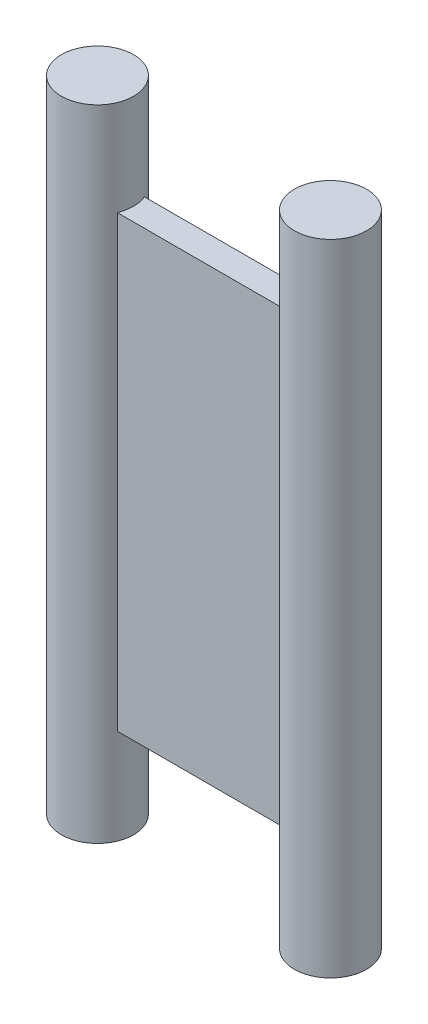
ISO-10303-21;
HEADER;
FILE_DESCRIPTION(('STEP AP214'),'2;1');
FILE_NAME('part.step','',(''),(''),'','','');
FILE_SCHEMA(('AUTOMOTIVE_DESIGN { 1 0 10303 214 1 1 1 1 }'));
ENDSEC;
DATA;
#1=APPLICATION_CONTEXT('core data for automotive mechanical design processes');
#2=APPLICATION_PROTOCOL_DEFINITION('international standard','automotive_design',2000,#1);
#3=PRODUCT_CONTEXT('',#1,'mechanical');
#4=PRODUCT('Part','Part','',(#3));
#5=PRODUCT_RELATED_PRODUCT_CATEGORY('part','',(#4));
#6=PRODUCT_DEFINITION_FORMATION('','',#4);
#7=PRODUCT_DEFINITION_CONTEXT('part definition',#1,'design');
#8=PRODUCT_DEFINITION('design','',#6,#7);
#9=PRODUCT_DEFINITION_SHAPE('','',#8);
#10=(LENGTH_UNIT() NAMED_UNIT(*) SI_UNIT(.MILLI.,.METRE.));
#11=(NAMED_UNIT(*) PLANE_ANGLE_UNIT() SI_UNIT($,.RADIAN.));
#12=(NAMED_UNIT(*) SI_UNIT($,.STERADIAN.) SOLID_ANGLE_UNIT());
#13=UNCERTAINTY_MEASURE_WITH_UNIT(LENGTH_MEASURE(1.E-05),#10,'distance_accuracy_value','');
#14=(GEOMETRIC_REPRESENTATION_CONTEXT(3) GLOBAL_UNCERTAINTY_ASSIGNED_CONTEXT((#13)) GLOBAL_UNIT_ASSIGNED_CONTEXT((#10,
#11,#12)) REPRESENTATION_CONTEXT('',''));
#15=CARTESIAN_POINT('',(0.,0.,0.));
#16=DIRECTION('',(0.,0.,1.));
#17=DIRECTION('',(1.,0.,0.));
#18=AXIS2_PLACEMENT_3D('',#15,#16,#17);
#19=CARTESIAN_POINT('',(4.28,16.5,0.5));
#20=DIRECTION('',(0.,0.,-1.));
#21=DIRECTION('',(-1.,0.,0.));
#22=AXIS2_PLACEMENT_3D('',#19,#20,#21);
#23=PLANE('',#22);
#24=DIRECTION('',(0.,-1.,0.));
#25=VECTOR('',#24,1.);
#26=CARTESIAN_POINT('',(3.0529608808192,20.,0.5));
#27=LINE('',#26,#25);
#28=CARTESIAN_POINT('',(3.0529608808192,16.5,0.5));
#29=VERTEX_POINT('',#28);
#30=CARTESIAN_POINT('',(3.0529608808192,0.,0.5));
#31=VERTEX_POINT('',#30);
#32=EDGE_CURVE('E53',#29,#31,#27,.T.);
#33=ORIENTED_EDGE('',*,*,#32,.F.);
#34=DIRECTION('',(1.,0.,0.));
#35=VECTOR('',#34,1.);
#36=CARTESIAN_POINT('',(4.28,16.5,0.5));
#37=LINE('',#36,#35);
#38=CARTESIAN_POINT('',(-3.0529608808192,16.5,0.500000000000001));
#39=VERTEX_POINT('',#38);
#40=EDGE_CURVE('E90',#39,#29,#37,.T.);
#41=ORIENTED_EDGE('',*,*,#40,.F.);
#42=DIRECTION('',(0.,-1.,0.));
#43=VECTOR('',#42,1.);
#44=CARTESIAN_POINT('',(-3.0529608808192,20.,0.500000000000001));
#45=LINE('',#44,#43);
#46=CARTESIAN_POINT('',(-3.0529608808192,0.,0.500000000000001));
#47=VERTEX_POINT('',#46);
#48=EDGE_CURVE('E103',#47,#39,#45,.F.);
#49=ORIENTED_EDGE('',*,*,#48,.F.);
#50=DIRECTION('',(1.,0.,0.));
#51=VECTOR('',#50,1.);
#52=CARTESIAN_POINT('',(4.28,0.,0.5));
#53=LINE('',#52,#51);
#54=EDGE_CURVE('E91',#47,#31,#53,.T.);
#55=ORIENTED_EDGE('',*,*,#54,.T.);
#56=EDGE_LOOP('',(#33,#41,#49,#55));
#57=FACE_BOUND('',#56,.T.);
#58=ADVANCED_FACE('F39',(#57),#23,.F.);
#59=CARTESIAN_POINT('',(4.28,16.5,-0.5));
#60=DIRECTION('',(0.,0.,1.));
#61=DIRECTION('',(1.,0.,0.));
#62=AXIS2_PLACEMENT_3D('',#59,#60,#61);
#63=PLANE('',#62);
#64=DIRECTION('',(0.,-1.,0.));
#65=VECTOR('',#64,1.);
#66=CARTESIAN_POINT('',(3.0529608808192,20.,-0.5));
#67=LINE('',#66,#65);
#68=CARTESIAN_POINT('',(3.0529608808192,0.,-0.5));
#69=VERTEX_POINT('',#68);
#70=CARTESIAN_POINT('',(3.0529608808192,16.5,-0.5));
#71=VERTEX_POINT('',#70);
#72=EDGE_CURVE('E78',#69,#71,#67,.F.);
#73=ORIENTED_EDGE('',*,*,#72,.F.);
#74=DIRECTION('',(-1.,0.,0.));
#75=VECTOR('',#74,1.);
#76=CARTESIAN_POINT('',(4.28,0.,-0.5));
#77=LINE('',#76,#75);
#78=CARTESIAN_POINT('',(-3.0529608808192,0.,-0.499999999999999));
#79=VERTEX_POINT('',#78);
#80=EDGE_CURVE('E60',#69,#79,#77,.T.);
#81=ORIENTED_EDGE('',*,*,#80,.T.);
#82=DIRECTION('',(0.,-1.,0.));
#83=VECTOR('',#82,1.);
#84=CARTESIAN_POINT('',(-3.0529608808192,20.,-0.499999999999999));
#85=LINE('',#84,#83);
#86=CARTESIAN_POINT('',(-3.0529608808192,16.5,-0.499999999999999));
#87=VERTEX_POINT('',#86);
#88=EDGE_CURVE('E105',#87,#79,#85,.T.);
#89=ORIENTED_EDGE('',*,*,#88,.F.);
#90=DIRECTION('',(-1.,0.,0.));
#91=VECTOR('',#90,1.);
#92=CARTESIAN_POINT('',(4.28,16.5,-0.5));
#93=LINE('',#92,#91);
#94=EDGE_CURVE('E85',#71,#87,#93,.T.);
#95=ORIENTED_EDGE('',*,*,#94,.F.);
#96=EDGE_LOOP('',(#73,#81,#89,#95));
#97=FACE_BOUND('',#96,.T.);
#98=ADVANCED_FACE('F84',(#97),#63,.F.);
#99=CARTESIAN_POINT('',(-4.28,20.,0.));
#100=DIRECTION('',(0.,-1.,0.));
#101=DIRECTION('',(0.,0.,-1.));
#102=AXIS2_PLACEMENT_3D('',#99,#100,#101);
#103=CYLINDRICAL_SURFACE('',#102,1.325);
#104=CARTESIAN_POINT('',(-4.28,20.,0.));
#105=DIRECTION('',(0.,1.,0.));
#106=DIRECTION('',(0.,0.,1.));
#107=AXIS2_PLACEMENT_3D('',#104,#105,#106);
#108=CIRCLE('',#107,1.325);
#109=CARTESIAN_POINT('',(-4.28,20.,1.325));
#110=VERTEX_POINT('',#109);
#111=EDGE_CURVE('E107',#110,#110,#108,.T.);
#112=ORIENTED_EDGE('',*,*,#111,.F.);
#113=EDGE_LOOP('',(#112));
#114=FACE_BOUND('',#113,.T.);
#115=CARTESIAN_POINT('',(-4.28,-3.5,0.));
#116=DIRECTION('',(0.,1.,0.));
#117=DIRECTION('',(0.,0.,1.));
#118=AXIS2_PLACEMENT_3D('',#115,#116,#117);
#119=CIRCLE('',#118,1.325);
#120=CARTESIAN_POINT('',(-4.28,-3.5,1.325));
#121=VERTEX_POINT('',#120);
#122=EDGE_CURVE('E108',#121,#121,#119,.T.);
#123=ORIENTED_EDGE('',*,*,#122,.T.);
#124=EDGE_LOOP('',(#123));
#125=FACE_BOUND('',#124,.T.);
#126=ORIENTED_EDGE('',*,*,#48,.T.);
#127=CARTESIAN_POINT('',(-4.28,16.5,0.));
#128=DIRECTION('',(0.,-1.,0.));
#129=DIRECTION('',(0.,0.,-1.));
#130=AXIS2_PLACEMENT_3D('',#127,#128,#129);
#131=CIRCLE('',#130,1.325);
#132=EDGE_CURVE('E95',#39,#87,#131,.F.);
#133=ORIENTED_EDGE('',*,*,#132,.T.);
#134=ORIENTED_EDGE('',*,*,#88,.T.);
#135=CARTESIAN_POINT('',(-4.28,0.,0.));
#136=DIRECTION('',(0.,-1.,0.));
#137=DIRECTION('',(0.,0.,-1.));
#138=AXIS2_PLACEMENT_3D('',#135,#136,#137);
#139=CIRCLE('',#138,1.325);
#140=EDGE_CURVE('E46',#47,#79,#139,.F.);
#141=ORIENTED_EDGE('',*,*,#140,.F.);
#142=EDGE_LOOP('',(#126,#133,#134,#141));
#143=FACE_BOUND('',#142,.T.);
#144=ADVANCED_FACE('F138',(#114,#125,#143),#103,.T.);
#145=CARTESIAN_POINT('',(-4.28,20.,0.));
#146=DIRECTION('',(0.,1.,0.));
#147=DIRECTION('',(0.,0.,1.));
#148=AXIS2_PLACEMENT_3D('',#145,#146,#147);
#149=PLANE('',#148);
#150=ORIENTED_EDGE('',*,*,#111,.T.);
#151=EDGE_LOOP('',(#150));
#152=FACE_BOUND('',#151,.T.);
#153=ADVANCED_FACE('F144',(#152),#149,.T.);
#154=CARTESIAN_POINT('',(-4.28,-3.5,0.));
#155=DIRECTION('',(0.,1.,0.));
#156=DIRECTION('',(0.,0.,1.));
#157=AXIS2_PLACEMENT_3D('',#154,#155,#156);
#158=PLANE('',#157);
#159=ORIENTED_EDGE('',*,*,#122,.F.);
#160=EDGE_LOOP('',(#159));
#161=FACE_BOUND('',#160,.T.);
#162=ADVANCED_FACE('F150',(#161),#158,.F.);
#163=CARTESIAN_POINT('',(0.,16.5,0.));
#164=DIRECTION('',(0.,-1.,0.));
#165=DIRECTION('',(0.,0.,-1.));
#166=AXIS2_PLACEMENT_3D('',#163,#164,#165);
#167=PLANE('',#166);
#168=CARTESIAN_POINT('',(4.28,16.5,0.));
#169=DIRECTION('',(0.,-1.,0.));
#170=DIRECTION('',(0.,0.,-1.));
#171=AXIS2_PLACEMENT_3D('',#168,#169,#170);
#172=CIRCLE('',#171,1.325);
#173=EDGE_CURVE('E111',#71,#29,#172,.F.);
#174=ORIENTED_EDGE('',*,*,#173,.F.);
#175=ORIENTED_EDGE('',*,*,#94,.T.);
#176=ORIENTED_EDGE('',*,*,#132,.F.);
#177=ORIENTED_EDGE('',*,*,#40,.T.);
#178=EDGE_LOOP('',(#174,#175,#176,#177));
#179=FACE_BOUND('',#178,.T.);
#180=ADVANCED_FACE('F141',(#179),#167,.F.);
#181=CARTESIAN_POINT('',(0.,0.,0.));
#182=DIRECTION('',(0.,-1.,0.));
#183=DIRECTION('',(0.,0.,-1.));
#184=AXIS2_PLACEMENT_3D('',#181,#182,#183);
#185=PLANE('',#184);
#186=ORIENTED_EDGE('',*,*,#80,.F.);
#187=CARTESIAN_POINT('',(4.28,0.,0.));
#188=DIRECTION('',(0.,-1.,0.));
#189=DIRECTION('',(0.,0.,-1.));
#190=AXIS2_PLACEMENT_3D('',#187,#188,#189);
#191=CIRCLE('',#190,1.325);
#192=EDGE_CURVE('E11',#69,#31,#191,.F.);
#193=ORIENTED_EDGE('',*,*,#192,.T.);
#194=ORIENTED_EDGE('',*,*,#54,.F.);
#195=ORIENTED_EDGE('',*,*,#140,.T.);
#196=EDGE_LOOP('',(#186,#193,#194,#195));
#197=FACE_BOUND('',#196,.T.);
#198=ADVANCED_FACE('F89',(#197),#185,.T.);
#199=CARTESIAN_POINT('',(4.28,20.,0.));
#200=DIRECTION('',(0.,-1.,0.));
#201=DIRECTION('',(0.,0.,-1.));
#202=AXIS2_PLACEMENT_3D('',#199,#200,#201);
#203=CYLINDRICAL_SURFACE('',#202,1.325);
#204=CARTESIAN_POINT('',(4.28,20.,0.));
#205=DIRECTION('',(0.,1.,0.));
#206=DIRECTION('',(0.,0.,1.));
#207=AXIS2_PLACEMENT_3D('',#204,#205,#206);
#208=CIRCLE('',#207,1.325);
#209=CARTESIAN_POINT('',(4.28,20.,1.325));
#210=VERTEX_POINT('',#209);
#211=EDGE_CURVE('E116',#210,#210,#208,.T.);
#212=ORIENTED_EDGE('',*,*,#211,.F.);
#213=EDGE_LOOP('',(#212));
#214=FACE_BOUND('',#213,.T.);
#215=CARTESIAN_POINT('',(4.28,-3.5,0.));
#216=DIRECTION('',(0.,1.,0.));
#217=DIRECTION('',(0.,0.,1.));
#218=AXIS2_PLACEMENT_3D('',#215,#216,#217);
#219=CIRCLE('',#218,1.325);
#220=CARTESIAN_POINT('',(4.28,-3.5,1.325));
#221=VERTEX_POINT('',#220);
#222=EDGE_CURVE('E86',#221,#221,#219,.T.);
#223=ORIENTED_EDGE('',*,*,#222,.T.);
#224=EDGE_LOOP('',(#223));
#225=FACE_BOUND('',#224,.T.);
#226=ORIENTED_EDGE('',*,*,#72,.T.);
#227=ORIENTED_EDGE('',*,*,#173,.T.);
#228=ORIENTED_EDGE('',*,*,#32,.T.);
#229=ORIENTED_EDGE('',*,*,#192,.F.);
#230=EDGE_LOOP('',(#226,#227,#228,#229));
#231=FACE_BOUND('',#230,.T.);
#232=ADVANCED_FACE('F77',(#214,#225,#231),#203,.T.);
#233=CARTESIAN_POINT('',(4.28,20.,0.));
#234=DIRECTION('',(0.,1.,0.));
#235=DIRECTION('',(0.,0.,1.));
#236=AXIS2_PLACEMENT_3D('',#233,#234,#235);
#237=PLANE('',#236);
#238=ORIENTED_EDGE('',*,*,#211,.T.);
#239=EDGE_LOOP('',(#238));
#240=FACE_BOUND('',#239,.T.);
#241=ADVANCED_FACE('F125',(#240),#237,.T.);
#242=CARTESIAN_POINT('',(4.28,-3.5,0.));
#243=DIRECTION('',(0.,1.,0.));
#244=DIRECTION('',(0.,0.,1.));
#245=AXIS2_PLACEMENT_3D('',#242,#243,#244);
#246=PLANE('',#245);
#247=ORIENTED_EDGE('',*,*,#222,.F.);
#248=EDGE_LOOP('',(#247));
#249=FACE_BOUND('',#248,.T.);
#250=ADVANCED_FACE('F123',(#249),#246,.F.);
#251=CLOSED_SHELL('',(#58,#98,#144,#153,#162,#180,#198,#232,#241,#250));
#252=MANIFOLD_SOLID_BREP('B2',#251);
#253=ADVANCED_BREP_SHAPE_REPRESENTATION('',(#18,#252),#14);
#254=SHAPE_DEFINITION_REPRESENTATION(#9,#253);
ENDSEC;
END-ISO-10303-21;
